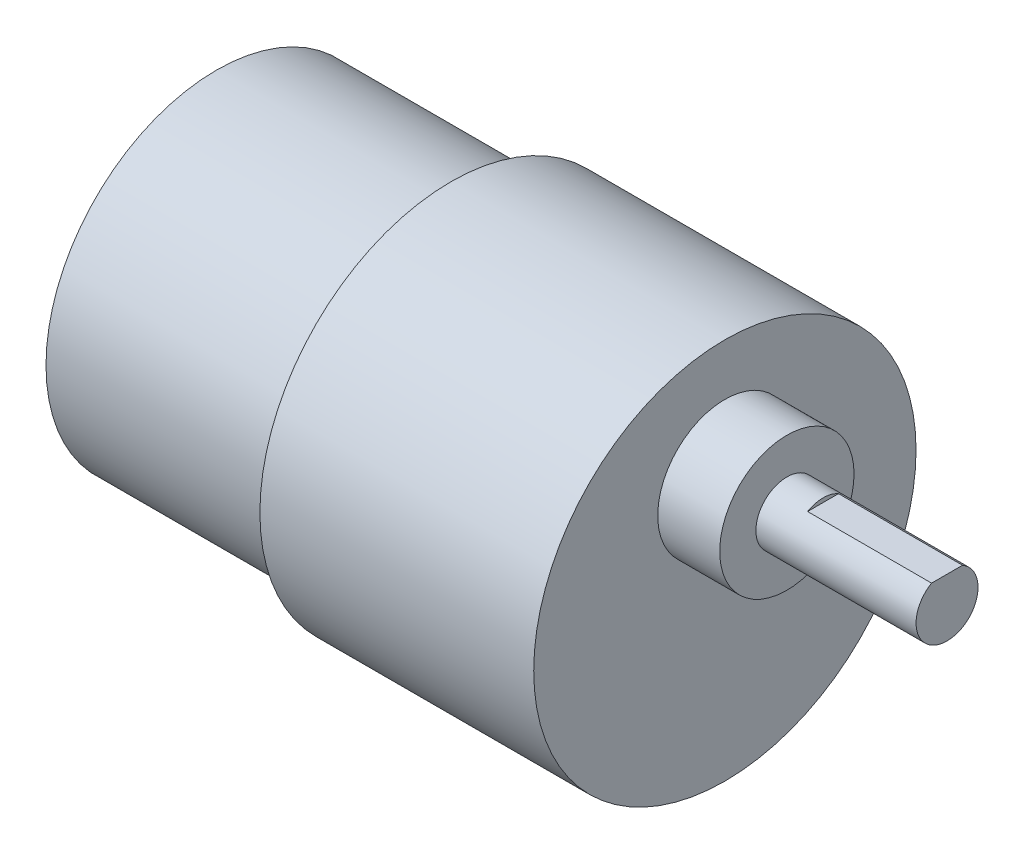
ISO-10303-21;
HEADER;
FILE_DESCRIPTION(('STEP AP214'),'2;1');
FILE_NAME('part.step','',(''),(''),'','','');
FILE_SCHEMA(('AUTOMOTIVE_DESIGN { 1 0 10303 214 1 1 1 1 }'));
ENDSEC;
DATA;
#1=APPLICATION_CONTEXT('core data for automotive mechanical design processes');
#2=APPLICATION_PROTOCOL_DEFINITION('international standard','automotive_design',2000,#1);
#3=PRODUCT_CONTEXT('',#1,'mechanical');
#4=PRODUCT('Part','Part','',(#3));
#5=PRODUCT_RELATED_PRODUCT_CATEGORY('part','',(#4));
#6=PRODUCT_DEFINITION_FORMATION('','',#4);
#7=PRODUCT_DEFINITION_CONTEXT('part definition',#1,'design');
#8=PRODUCT_DEFINITION('design','',#6,#7);
#9=PRODUCT_DEFINITION_SHAPE('','',#8);
#10=(LENGTH_UNIT() NAMED_UNIT(*) SI_UNIT(.MILLI.,.METRE.));
#11=(NAMED_UNIT(*) PLANE_ANGLE_UNIT() SI_UNIT($,.RADIAN.));
#12=(NAMED_UNIT(*) SI_UNIT($,.STERADIAN.) SOLID_ANGLE_UNIT());
#13=UNCERTAINTY_MEASURE_WITH_UNIT(LENGTH_MEASURE(1.E-05),#10,'distance_accuracy_value','');
#14=(GEOMETRIC_REPRESENTATION_CONTEXT(3) GLOBAL_UNCERTAINTY_ASSIGNED_CONTEXT((#13)) GLOBAL_UNIT_ASSIGNED_CONTEXT((#10,
#11,#12)) REPRESENTATION_CONTEXT('',''));
#15=CARTESIAN_POINT('',(0.,0.,0.));
#16=DIRECTION('',(0.,0.,1.));
#17=DIRECTION('',(1.,0.,0.));
#18=AXIS2_PLACEMENT_3D('',#15,#16,#17);
#19=CARTESIAN_POINT('',(22.7,0.,0.));
#20=DIRECTION('',(-1.,0.,0.));
#21=DIRECTION('',(0.,0.,1.));
#22=AXIS2_PLACEMENT_3D('',#19,#20,#21);
#23=CYLINDRICAL_SURFACE('',#22,16.5);
#24=CARTESIAN_POINT('',(22.7,0.,0.));
#25=DIRECTION('',(1.,0.,0.));
#26=DIRECTION('',(0.,0.,-1.));
#27=AXIS2_PLACEMENT_3D('',#24,#25,#26);
#28=CIRCLE('',#27,16.5);
#29=CARTESIAN_POINT('',(22.7,0.,-16.5));
#30=VERTEX_POINT('',#29);
#31=EDGE_CURVE('E93',#30,#30,#28,.T.);
#32=ORIENTED_EDGE('',*,*,#31,.F.);
#33=EDGE_LOOP('',(#32));
#34=FACE_BOUND('',#33,.T.);
#35=CARTESIAN_POINT('',(0.,0.,0.));
#36=DIRECTION('',(1.,0.,0.));
#37=DIRECTION('',(0.,0.,-1.));
#38=AXIS2_PLACEMENT_3D('',#35,#36,#37);
#39=CIRCLE('',#38,16.5);
#40=CARTESIAN_POINT('',(0.,0.,-16.5));
#41=VERTEX_POINT('',#40);
#42=EDGE_CURVE('E103',#41,#41,#39,.T.);
#43=ORIENTED_EDGE('',*,*,#42,.T.);
#44=EDGE_LOOP('',(#43));
#45=FACE_BOUND('',#44,.T.);
#46=ADVANCED_FACE('F40',(#34,#45),#23,.T.);
#47=CARTESIAN_POINT('',(0.,0.,0.));
#48=DIRECTION('',(1.,0.,0.));
#49=DIRECTION('',(0.,0.,-1.));
#50=AXIS2_PLACEMENT_3D('',#47,#48,#49);
#51=PLANE('',#50);
#52=CARTESIAN_POINT('',(0.,0.,0.));
#53=DIRECTION('',(-1.,0.,0.));
#54=DIRECTION('',(0.,0.,1.));
#55=AXIS2_PLACEMENT_3D('',#52,#53,#54);
#56=CIRCLE('',#55,6.);
#57=CARTESIAN_POINT('',(0.,0.,6.));
#58=VERTEX_POINT('',#57);
#59=EDGE_CURVE('E85',#58,#58,#56,.T.);
#60=ORIENTED_EDGE('',*,*,#59,.F.);
#61=EDGE_LOOP('',(#60));
#62=FACE_BOUND('',#61,.T.);
#63=ORIENTED_EDGE('',*,*,#42,.F.);
#64=EDGE_LOOP('',(#63));
#65=FACE_BOUND('',#64,.T.);
#66=ADVANCED_FACE('F117',(#62,#65),#51,.F.);
#67=CARTESIAN_POINT('',(46.7,0.,0.));
#68=DIRECTION('',(-1.,0.,0.));
#69=DIRECTION('',(0.,0.,1.));
#70=AXIS2_PLACEMENT_3D('',#67,#68,#69);
#71=CYLINDRICAL_SURFACE('',#70,18.5);
#72=CARTESIAN_POINT('',(22.7,0.,0.));
#73=DIRECTION('',(1.,0.,0.));
#74=DIRECTION('',(0.,0.,-1.));
#75=AXIS2_PLACEMENT_3D('',#72,#73,#74);
#76=CIRCLE('',#75,18.5);
#77=CARTESIAN_POINT('',(22.7,0.,-18.5));
#78=VERTEX_POINT('',#77);
#79=EDGE_CURVE('E100',#78,#78,#76,.T.);
#80=ORIENTED_EDGE('',*,*,#79,.T.);
#81=EDGE_LOOP('',(#80));
#82=FACE_BOUND('',#81,.T.);
#83=CARTESIAN_POINT('',(49.2,0.,0.));
#84=DIRECTION('',(1.,0.,0.));
#85=DIRECTION('',(0.,0.,-1.));
#86=AXIS2_PLACEMENT_3D('',#83,#84,#85);
#87=CIRCLE('',#86,18.5);
#88=CARTESIAN_POINT('',(49.2,0.,-18.5));
#89=VERTEX_POINT('',#88);
#90=EDGE_CURVE('E89',#89,#89,#87,.T.);
#91=ORIENTED_EDGE('',*,*,#90,.F.);
#92=EDGE_LOOP('',(#91));
#93=FACE_BOUND('',#92,.T.);
#94=ADVANCED_FACE('F120',(#82,#93),#71,.T.);
#95=CARTESIAN_POINT('',(22.7,0.,0.));
#96=DIRECTION('',(1.,0.,0.));
#97=DIRECTION('',(0.,0.,-1.));
#98=AXIS2_PLACEMENT_3D('',#95,#96,#97);
#99=PLANE('',#98);
#100=ORIENTED_EDGE('',*,*,#31,.T.);
#101=EDGE_LOOP('',(#100));
#102=FACE_BOUND('',#101,.T.);
#103=ORIENTED_EDGE('',*,*,#79,.F.);
#104=EDGE_LOOP('',(#103));
#105=FACE_BOUND('',#104,.T.);
#106=ADVANCED_FACE('F132',(#102,#105),#99,.F.);
#107=CARTESIAN_POINT('',(49.2,0.,0.));
#108=DIRECTION('',(1.,0.,0.));
#109=DIRECTION('',(0.,0.,-1.));
#110=AXIS2_PLACEMENT_3D('',#107,#108,#109);
#111=PLANE('',#110);
#112=CARTESIAN_POINT('',(49.2,7.,0.));
#113=DIRECTION('',(1.,0.,0.));
#114=DIRECTION('',(0.,0.,-1.));
#115=AXIS2_PLACEMENT_3D('',#112,#113,#114);
#116=CIRCLE('',#115,6.5);
#117=CARTESIAN_POINT('',(49.2,7.,-6.5));
#118=VERTEX_POINT('',#117);
#119=EDGE_CURVE('E96',#118,#118,#116,.T.);
#120=ORIENTED_EDGE('',*,*,#119,.F.);
#121=EDGE_LOOP('',(#120));
#122=FACE_BOUND('',#121,.T.);
#123=ORIENTED_EDGE('',*,*,#90,.T.);
#124=EDGE_LOOP('',(#123));
#125=FACE_BOUND('',#124,.T.);
#126=ADVANCED_FACE('F136',(#122,#125),#111,.T.);
#127=CARTESIAN_POINT('',(55.2,7.,0.));
#128=DIRECTION('',(1.,0.,0.));
#129=DIRECTION('',(0.,0.,-1.));
#130=AXIS2_PLACEMENT_3D('',#127,#128,#129);
#131=PLANE('',#130);
#132=CARTESIAN_POINT('',(55.2,7.,0.));
#133=DIRECTION('',(1.,0.,0.));
#134=DIRECTION('',(0.,0.,-1.));
#135=AXIS2_PLACEMENT_3D('',#132,#133,#134);
#136=CIRCLE('',#135,3.);
#137=CARTESIAN_POINT('',(55.2,7.,-3.));
#138=VERTEX_POINT('',#137);
#139=EDGE_CURVE('E90',#138,#138,#136,.T.);
#140=ORIENTED_EDGE('',*,*,#139,.F.);
#141=EDGE_LOOP('',(#140));
#142=FACE_BOUND('',#141,.T.);
#143=CARTESIAN_POINT('',(55.2,7.,0.));
#144=DIRECTION('',(1.,0.,0.));
#145=DIRECTION('',(0.,0.,-1.));
#146=AXIS2_PLACEMENT_3D('',#143,#144,#145);
#147=CIRCLE('',#146,6.5);
#148=CARTESIAN_POINT('',(55.2,7.,-6.5));
#149=VERTEX_POINT('',#148);
#150=EDGE_CURVE('E97',#149,#149,#147,.T.);
#151=ORIENTED_EDGE('',*,*,#150,.T.);
#152=EDGE_LOOP('',(#151));
#153=FACE_BOUND('',#152,.T.);
#154=ADVANCED_FACE('F141',(#142,#153),#131,.T.);
#155=CARTESIAN_POINT('',(55.2,7.,0.));
#156=DIRECTION('',(-1.,0.,0.));
#157=DIRECTION('',(0.,0.,1.));
#158=AXIS2_PLACEMENT_3D('',#155,#156,#157);
#159=CYLINDRICAL_SURFACE('',#158,6.5);
#160=ORIENTED_EDGE('',*,*,#150,.F.);
#161=EDGE_LOOP('',(#160));
#162=FACE_BOUND('',#161,.T.);
#163=ORIENTED_EDGE('',*,*,#119,.T.);
#164=EDGE_LOOP('',(#163));
#165=FACE_BOUND('',#164,.T.);
#166=ADVANCED_FACE('F138',(#162,#165),#159,.T.);
#167=CARTESIAN_POINT('',(70.7,7.,0.));
#168=DIRECTION('',(-1.,0.,0.));
#169=DIRECTION('',(0.,0.,1.));
#170=AXIS2_PLACEMENT_3D('',#167,#168,#169);
#171=CYLINDRICAL_SURFACE('',#170,3.);
#172=CARTESIAN_POINT('',(70.7,7.,0.));
#173=DIRECTION('',(1.,0.,0.));
#174=DIRECTION('',(0.,0.,-1.));
#175=AXIS2_PLACEMENT_3D('',#172,#173,#174);
#176=CIRCLE('',#175,3.);
#177=CARTESIAN_POINT('',(70.7,9.6,1.49666295470957));
#178=VERTEX_POINT('',#177);
#179=CARTESIAN_POINT('',(70.7,9.6,-1.49666295470957));
#180=VERTEX_POINT('',#179);
#181=EDGE_CURVE('E71',#178,#180,#176,.T.);
#182=ORIENTED_EDGE('',*,*,#181,.F.);
#183=DIRECTION('',(-1.,0.,0.));
#184=VECTOR('',#183,1.);
#185=CARTESIAN_POINT('',(240.646648993955,9.6,1.49666295470958));
#186=LINE('',#185,#184);
#187=CARTESIAN_POINT('',(58.7,9.6,1.49666295470958));
#188=VERTEX_POINT('',#187);
#189=EDGE_CURVE('E68',#178,#188,#186,.T.);
#190=ORIENTED_EDGE('',*,*,#189,.T.);
#191=CARTESIAN_POINT('',(58.7,7.,0.));
#192=DIRECTION('',(1.,0.,0.));
#193=DIRECTION('',(0.,0.,-1.));
#194=AXIS2_PLACEMENT_3D('',#191,#192,#193);
#195=CIRCLE('',#194,3.);
#196=CARTESIAN_POINT('',(58.7,9.6,-1.49666295470957));
#197=VERTEX_POINT('',#196);
#198=EDGE_CURVE('E55',#197,#188,#195,.T.);
#199=ORIENTED_EDGE('',*,*,#198,.F.);
#200=DIRECTION('',(-1.,0.,0.));
#201=VECTOR('',#200,1.);
#202=CARTESIAN_POINT('',(240.646648993955,9.6,-1.49666295470958));
#203=LINE('',#202,#201);
#204=EDGE_CURVE('E74',#180,#197,#203,.T.);
#205=ORIENTED_EDGE('',*,*,#204,.F.);
#206=EDGE_LOOP('',(#182,#190,#199,#205));
#207=FACE_BOUND('',#206,.T.);
#208=ORIENTED_EDGE('',*,*,#139,.T.);
#209=EDGE_LOOP('',(#208));
#210=FACE_BOUND('',#209,.T.);
#211=ADVANCED_FACE('F69',(#207,#210),#171,.T.);
#212=CARTESIAN_POINT('',(70.7,7.,0.));
#213=DIRECTION('',(1.,0.,0.));
#214=DIRECTION('',(0.,0.,-1.));
#215=AXIS2_PLACEMENT_3D('',#212,#213,#214);
#216=PLANE('',#215);
#217=DIRECTION('',(0.,0.,-1.));
#218=VECTOR('',#217,1.);
#219=CARTESIAN_POINT('',(70.7,9.6,1.49666295470958));
#220=LINE('',#219,#218);
#221=EDGE_CURVE('E62',#178,#180,#220,.T.);
#222=ORIENTED_EDGE('',*,*,#221,.F.);
#223=ORIENTED_EDGE('',*,*,#181,.T.);
#224=EDGE_LOOP('',(#222,#223));
#225=FACE_BOUND('',#224,.T.);
#226=ADVANCED_FACE('F151',(#225),#216,.T.);
#227=CARTESIAN_POINT('',(240.646648993955,9.6,1.49666295470958));
#228=DIRECTION('',(0.,1.,0.));
#229=DIRECTION('',(0.,0.,1.));
#230=AXIS2_PLACEMENT_3D('',#227,#228,#229);
#231=PLANE('',#230);
#232=ORIENTED_EDGE('',*,*,#189,.F.);
#233=ORIENTED_EDGE('',*,*,#221,.T.);
#234=ORIENTED_EDGE('',*,*,#204,.T.);
#235=DIRECTION('',(0.,0.,-1.));
#236=VECTOR('',#235,1.);
#237=CARTESIAN_POINT('',(58.7,9.6,1.49666295470958));
#238=LINE('',#237,#236);
#239=EDGE_CURVE('E78',#188,#197,#238,.T.);
#240=ORIENTED_EDGE('',*,*,#239,.F.);
#241=EDGE_LOOP('',(#232,#233,#234,#240));
#242=FACE_BOUND('',#241,.T.);
#243=ADVANCED_FACE('F81',(#242),#231,.T.);
#244=CARTESIAN_POINT('',(58.7,7.,0.));
#245=DIRECTION('',(1.,0.,0.));
#246=DIRECTION('',(0.,0.,-1.));
#247=AXIS2_PLACEMENT_3D('',#244,#245,#246);
#248=PLANE('',#247);
#249=ORIENTED_EDGE('',*,*,#239,.T.);
#250=ORIENTED_EDGE('',*,*,#198,.T.);
#251=EDGE_LOOP('',(#249,#250));
#252=FACE_BOUND('',#251,.T.);
#253=ADVANCED_FACE('F77',(#252),#248,.T.);
#254=CARTESIAN_POINT('',(-2.,0.,0.));
#255=DIRECTION('',(1.,0.,0.));
#256=DIRECTION('',(0.,0.,-1.));
#257=AXIS2_PLACEMENT_3D('',#254,#255,#256);
#258=CYLINDRICAL_SURFACE('',#257,6.);
#259=CARTESIAN_POINT('',(-1.5,0.,0.));
#260=DIRECTION('',(-1.,0.,0.));
#261=DIRECTION('',(0.,0.,1.));
#262=AXIS2_PLACEMENT_3D('',#259,#260,#261);
#263=CIRCLE('',#262,6.);
#264=CARTESIAN_POINT('',(-1.5,0.,6.));
#265=VERTEX_POINT('',#264);
#266=EDGE_CURVE('E11',#265,#265,#263,.F.);
#267=ORIENTED_EDGE('',*,*,#266,.T.);
#268=EDGE_LOOP('',(#267));
#269=FACE_BOUND('',#268,.T.);
#270=ORIENTED_EDGE('',*,*,#59,.T.);
#271=EDGE_LOOP('',(#270));
#272=FACE_BOUND('',#271,.T.);
#273=ADVANCED_FACE('F115',(#269,#272),#258,.T.);
#274=CARTESIAN_POINT('',(-2.,0.,0.));
#275=DIRECTION('',(-1.,0.,0.));
#276=DIRECTION('',(0.,0.,1.));
#277=AXIS2_PLACEMENT_3D('',#274,#275,#276);
#278=PLANE('',#277);
#279=CARTESIAN_POINT('',(-2.,0.,0.));
#280=DIRECTION('',(-1.,0.,0.));
#281=DIRECTION('',(0.,0.,1.));
#282=AXIS2_PLACEMENT_3D('',#279,#280,#281);
#283=CIRCLE('',#282,5.5);
#284=CARTESIAN_POINT('',(-2.,0.,5.5));
#285=VERTEX_POINT('',#284);
#286=EDGE_CURVE('E48',#285,#285,#283,.T.);
#287=ORIENTED_EDGE('',*,*,#286,.T.);
#288=EDGE_LOOP('',(#287));
#289=FACE_BOUND('',#288,.T.);
#290=ADVANCED_FACE('F160',(#289),#278,.T.);
#291=CARTESIAN_POINT('',(-1.5,0.,0.));
#292=DIRECTION('',(-1.,0.,0.));
#293=DIRECTION('',(0.,0.,1.));
#294=AXIS2_PLACEMENT_3D('',#291,#292,#293);
#295=TOROIDAL_SURFACE('',#294,5.5,0.5);
#296=ORIENTED_EDGE('',*,*,#266,.F.);
#297=EDGE_LOOP('',(#296));
#298=FACE_BOUND('',#297,.T.);
#299=ORIENTED_EDGE('',*,*,#286,.F.);
#300=EDGE_LOOP('',(#299));
#301=FACE_BOUND('',#300,.T.);
#302=ADVANCED_FACE('F42',(#298,#301),#295,.T.);
#303=CLOSED_SHELL('',(#46,#66,#94,#106,#126,#154,#166,#211,#226,#243,#253,#273,#290,#302));
#304=MANIFOLD_SOLID_BREP('B2',#303);
#305=ADVANCED_BREP_SHAPE_REPRESENTATION('',(#18,#304),#14);
#306=SHAPE_DEFINITION_REPRESENTATION(#9,#305);
ENDSEC;
END-ISO-10303-21;
